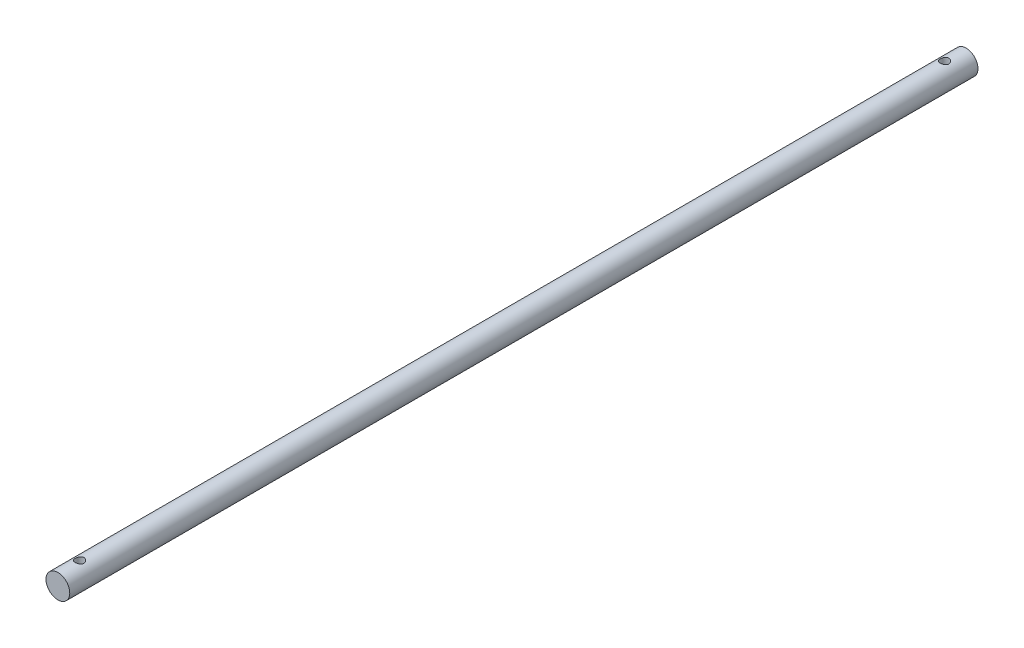
ISO-10303-21;
HEADER;
FILE_DESCRIPTION(('STEP AP214'),'2;1');
FILE_NAME('part.step','',(''),(''),'','','');
FILE_SCHEMA(('AUTOMOTIVE_DESIGN { 1 0 10303 214 1 1 1 1 }'));
ENDSEC;
DATA;
#1=APPLICATION_CONTEXT('core data for automotive mechanical design processes');
#2=APPLICATION_PROTOCOL_DEFINITION('international standard','automotive_design',2000,#1);
#3=PRODUCT_CONTEXT('',#1,'mechanical');
#4=PRODUCT('Part','Part','',(#3));
#5=PRODUCT_RELATED_PRODUCT_CATEGORY('part','',(#4));
#6=PRODUCT_DEFINITION_FORMATION('','',#4);
#7=PRODUCT_DEFINITION_CONTEXT('part definition',#1,'design');
#8=PRODUCT_DEFINITION('design','',#6,#7);
#9=PRODUCT_DEFINITION_SHAPE('','',#8);
#10=(LENGTH_UNIT() NAMED_UNIT(*) SI_UNIT(.MILLI.,.METRE.));
#11=(NAMED_UNIT(*) PLANE_ANGLE_UNIT() SI_UNIT($,.RADIAN.));
#12=(NAMED_UNIT(*) SI_UNIT($,.STERADIAN.) SOLID_ANGLE_UNIT());
#13=UNCERTAINTY_MEASURE_WITH_UNIT(LENGTH_MEASURE(1.E-05),#10,'distance_accuracy_value','');
#14=(GEOMETRIC_REPRESENTATION_CONTEXT(3) GLOBAL_UNCERTAINTY_ASSIGNED_CONTEXT((#13)) GLOBAL_UNIT_ASSIGNED_CONTEXT((#10,
#11,#12)) REPRESENTATION_CONTEXT('',''));
#15=CARTESIAN_POINT('',(0.,0.,0.));
#16=DIRECTION('',(0.,0.,1.));
#17=DIRECTION('',(1.,0.,0.));
#18=AXIS2_PLACEMENT_3D('',#15,#16,#17);
#19=CARTESIAN_POINT('',(0.,0.,210.));
#20=DIRECTION('',(0.,0.,-1.));
#21=DIRECTION('',(-1.,0.,0.));
#22=AXIS2_PLACEMENT_3D('',#19,#20,#21);
#23=CYLINDRICAL_SURFACE('',#22,2.75);
#24=CARTESIAN_POINT('',(0.,-2.75,206.));
#25=CARTESIAN_POINT('',(0.0542715836124512,-2.75000102828592,206.000001406463));
#26=CARTESIAN_POINT('',(0.108533268023081,-2.74837919091224,205.995567902627));
#27=CARTESIAN_POINT('',(0.215441396661633,-2.74207073754075,205.978017772416));
#28=CARTESIAN_POINT('',(0.268087964675669,-2.73738435703378,205.964901813232));
#29=CARTESIAN_POINT('',(0.370208982732229,-2.72545162836973,205.930507644077));
#30=CARTESIAN_POINT('',(0.419689127060862,-2.71821003742993,205.909244595846));
#31=CARTESIAN_POINT('',(0.514378106430642,-2.7018931355003,205.859234525943));
#32=CARTESIAN_POINT('',(0.559585868286284,-2.69281736556791,205.830485630665));
#33=CARTESIAN_POINT('',(0.646268474954172,-2.67336544251623,205.765108008407));
#34=CARTESIAN_POINT('',(0.687548063931853,-2.66295402798401,205.728230976144));
#35=CARTESIAN_POINT('',(0.7634919958075,-2.64218336390661,205.6481711256));
#36=CARTESIAN_POINT('',(0.798154485530767,-2.63182412976351,205.604986546799));
#37=CARTESIAN_POINT('',(0.86108520482516,-2.61192692799095,205.511672475245));
#38=CARTESIAN_POINT('',(0.889083899715419,-2.60243096933403,205.461351363906));
#39=CARTESIAN_POINT('',(0.936134697200384,-2.58588061286966,205.356314261985));
#40=CARTESIAN_POINT('',(0.955190130970069,-2.57882530622898,205.301599916698));
#41=CARTESIAN_POINT('',(0.983053381727303,-2.56833043749789,205.191570671626));
#42=CARTESIAN_POINT('',(0.992232085048729,-2.56476051810849,205.136362532154));
#43=CARTESIAN_POINT('',(1.00124109076665,-2.56125788758605,205.025083122115));
#44=CARTESIAN_POINT('',(1.00107496394965,-2.56132378715702,204.969012189421));
#45=CARTESIAN_POINT('',(0.991683838835926,-2.56497242531705,204.860923898732));
#46=CARTESIAN_POINT('',(0.982964271111852,-2.56835894106268,204.808854797382));
#47=CARTESIAN_POINT('',(0.957546210263849,-2.57794255403146,204.706976769156));
#48=CARTESIAN_POINT('',(0.940846587774043,-2.58414004906813,204.657168163286));
#49=CARTESIAN_POINT('',(0.899650242741097,-2.59877143656644,204.560161818709));
#50=CARTESIAN_POINT('',(0.875017252502519,-2.60724394841139,204.513028029977));
#51=CARTESIAN_POINT('',(0.818748232812849,-2.62545692968766,204.423412624226));
#52=CARTESIAN_POINT('',(0.787109890287122,-2.63519781748133,204.380932550743));
#53=CARTESIAN_POINT('',(0.715383379718306,-2.65559784978113,204.299020145248));
#54=CARTESIAN_POINT('',(0.674888914115547,-2.66627621521455,204.259947543065));
#55=CARTESIAN_POINT('',(0.587796439133001,-2.68681874920339,204.189044494753));
#56=CARTESIAN_POINT('',(0.541197601732023,-2.69668280700645,204.157215032717));
#57=CARTESIAN_POINT('',(0.442345741239065,-2.71466109847137,204.101336418754));
#58=CARTESIAN_POINT('',(0.390023720211987,-2.72274937801428,204.07740038853));
#59=CARTESIAN_POINT('',(0.281728959561486,-2.73607360346721,204.038787428692));
#60=CARTESIAN_POINT('',(0.225757751375328,-2.74131073738571,204.02410664222));
#61=CARTESIAN_POINT('',(0.11478608367634,-2.74813714481768,204.005096993463));
#62=CARTESIAN_POINT('',(0.0598790944675544,-2.74989711432767,204.000283267754));
#63=CARTESIAN_POINT('',(-0.0499795667814124,-2.75009397659377,203.999741232411));
#64=CARTESIAN_POINT('',(-0.104931227273116,-2.74853155450921,204.004011049526));
#65=CARTESIAN_POINT('',(-0.21126813036544,-2.74237196117977,204.021141703208));
#66=CARTESIAN_POINT('',(-0.262710667294032,-2.73788504615824,204.03369061233));
#67=CARTESIAN_POINT('',(-0.362728585048038,-2.72643794415668,204.066618428083));
#68=CARTESIAN_POINT('',(-0.411303592012267,-2.71947743550269,204.086998353113));
#69=CARTESIAN_POINT('',(-0.505765388196063,-2.70352785875039,204.13564777837));
#70=CARTESIAN_POINT('',(-0.551535216679319,-2.69448636437226,204.164126674867));
#71=CARTESIAN_POINT('',(-0.637795338528298,-2.67538261287497,204.227926549934));
#72=CARTESIAN_POINT('',(-0.678283760636934,-2.6653199961946,204.263249942621));
#73=CARTESIAN_POINT('',(-0.755135775069422,-2.64460590178417,204.342003894075));
#74=CARTESIAN_POINT('',(-0.791154493963319,-2.63395220828256,204.385771279064));
#75=CARTESIAN_POINT('',(-0.855397050762122,-2.61379664346752,204.478945491726));
#76=CARTESIAN_POINT('',(-0.883620400746453,-2.60429484427326,204.528352672128));
#77=CARTESIAN_POINT('',(-0.931445925955398,-2.5875770963738,204.631686473617));
#78=CARTESIAN_POINT('',(-0.951029808644739,-2.58036600678337,204.685622399021));
#79=CARTESIAN_POINT('',(-0.980719773373599,-2.56923043824549,204.796358723946));
#80=CARTESIAN_POINT('',(-0.990831247611741,-2.56530408958517,204.853157474364));
#81=CARTESIAN_POINT('',(-1.0008235052886,-2.56142114085343,204.96429565408));
#82=CARTESIAN_POINT('',(-1.00128784493909,-2.56123811777665,205.01857518387));
#83=CARTESIAN_POINT('',(-0.993451162726877,-2.56428783487999,205.126394783377));
#84=CARTESIAN_POINT('',(-0.985150873770358,-2.56752028945478,205.179934914543));
#85=CARTESIAN_POINT('',(-0.960464129671412,-2.57685358798143,205.283297477867));
#86=CARTESIAN_POINT('',(-0.944301768141373,-2.58287473014432,205.333181229599));
#87=CARTESIAN_POINT('',(-0.904542113040592,-2.59706506711977,205.429561390045));
#88=CARTESIAN_POINT('',(-0.880942996186518,-2.60523478862223,205.476056964628));
#89=CARTESIAN_POINT('',(-0.825605739738892,-2.62331120262658,205.5668707271));
#90=CARTESIAN_POINT('',(-0.793519132090319,-2.63328440127836,205.610963198092));
#91=CARTESIAN_POINT('',(-0.72267086243472,-2.65360200752593,205.693325075839));
#92=CARTESIAN_POINT('',(-0.683907144647634,-2.66394652866745,205.731592682352));
#93=CARTESIAN_POINT('',(-0.598501849490875,-2.68445803074377,205.803149733144));
#94=CARTESIAN_POINT('',(-0.551564727014751,-2.69459070625497,205.836097749901));
#95=CARTESIAN_POINT('',(-0.45246792393593,-2.71298901447151,205.893618537786));
#96=CARTESIAN_POINT('',(-0.400308357228813,-2.72125468788124,205.918191491512));
#97=CARTESIAN_POINT('',(-0.291211408351302,-2.73509951863932,205.958454833936));
#98=CARTESIAN_POINT('',(-0.234204430246379,-2.74062712951143,205.973975701989));
#99=CARTESIAN_POINT('',(-0.118127131621762,-2.74807603940632,205.9947453228));
#100=CARTESIAN_POINT('',(-0.0590577047217929,-2.74999888103125,205.999998469503));
#101=CARTESIAN_POINT('',(0.,-2.75,206.));
#102=B_SPLINE_CURVE_WITH_KNOTS('',3,(#24,#25,#26,#27,#28,#29,#30,#31,#32,#33,#34,#35,#36,#37,
#38,#39,#40,#41,#42,#43,#44,#45,#46,#47,#48,#49,#50,#51,#52,#53,#54,#55,#56,#57,#58,#59,#60,#61,
#62,#63,#64,#65,#66,#67,#68,#69,#70,#71,#72,#73,#74,#75,#76,#77,#78,#79,#80,#81,#82,#83,#84,#85,
#86,#87,#88,#89,#90,#91,#92,#93,#94,#95,#96,#97,#98,#99,#100,#101),.UNSPECIFIED.,.T.,.F.,(4,2,2,
2,2,2,2,2,2,2,2,2,2,2,2,2,2,2,2,2,2,2,2,2,2,2,2,2,2,2,2,2,2,2,2,2,2,2,4),(0.,0.162597052068218,
0.325181611045026,0.487465058159494,0.649789161721103,0.818009820819269,0.986277522644852,
1.16049696047028,1.33465145364931,1.50200969548544,1.66930398789926,1.82727379536547,
1.98526596590765,2.14613122186677,2.30704967282303,2.47808909474827,2.64915174120858,
2.82256896302791,2.99591387036394,3.16051402694476,3.32508024219343,3.48377539851091,
3.64249119960605,3.80575629202904,3.96907907474736,4.14129930415002,4.31353031056169,
4.4861242554694,4.6586198909163,4.82064870246276,4.982663966086,5.14031020509753,
5.29799512464463,5.46357833931485,5.62921262594589,5.80306928554153,5.97692215434632,
6.1539341379427,6.3308703548449),.UNSPECIFIED.);
#103=CARTESIAN_POINT('',(0.,-2.75,206.));
#104=VERTEX_POINT('',#103);
#105=EDGE_CURVE('E10',#104,#104,#102,.T.);
#106=ORIENTED_EDGE('',*,*,#105,.T.);
#107=EDGE_LOOP('',(#106));
#108=FACE_BOUND('',#107,.T.);
#109=CARTESIAN_POINT('',(0.,2.75,206.));
#110=CARTESIAN_POINT('',(-0.0542715836124512,2.75000102828592,206.000001406463));
#111=CARTESIAN_POINT('',(-0.108533268023081,2.74837919091224,205.995567902627));
#112=CARTESIAN_POINT('',(-0.215441396661633,2.74207073754075,205.978017772416));
#113=CARTESIAN_POINT('',(-0.268087964675669,2.73738435703378,205.964901813232));
#114=CARTESIAN_POINT('',(-0.370208982732229,2.72545162836973,205.930507644077));
#115=CARTESIAN_POINT('',(-0.419689127060862,2.71821003742993,205.909244595846));
#116=CARTESIAN_POINT('',(-0.514378106430642,2.7018931355003,205.859234525943));
#117=CARTESIAN_POINT('',(-0.559585868286284,2.69281736556791,205.830485630665));
#118=CARTESIAN_POINT('',(-0.646268474954172,2.67336544251623,205.765108008407));
#119=CARTESIAN_POINT('',(-0.687548063931853,2.66295402798401,205.728230976144));
#120=CARTESIAN_POINT('',(-0.7634919958075,2.64218336390661,205.6481711256));
#121=CARTESIAN_POINT('',(-0.798154485530767,2.63182412976351,205.604986546799));
#122=CARTESIAN_POINT('',(-0.86108520482516,2.61192692799095,205.511672475245));
#123=CARTESIAN_POINT('',(-0.889083899715419,2.60243096933403,205.461351363906));
#124=CARTESIAN_POINT('',(-0.936134697200384,2.58588061286966,205.356314261985));
#125=CARTESIAN_POINT('',(-0.955190130970069,2.57882530622898,205.301599916698));
#126=CARTESIAN_POINT('',(-0.983053381727303,2.56833043749789,205.191570671626));
#127=CARTESIAN_POINT('',(-0.992232085048729,2.56476051810849,205.136362532154));
#128=CARTESIAN_POINT('',(-1.00124109076665,2.56125788758605,205.025083122115));
#129=CARTESIAN_POINT('',(-1.00107496394965,2.56132378715702,204.969012189421));
#130=CARTESIAN_POINT('',(-0.991683838835926,2.56497242531705,204.860923898732));
#131=CARTESIAN_POINT('',(-0.982964271111852,2.56835894106268,204.808854797382));
#132=CARTESIAN_POINT('',(-0.957546210263849,2.57794255403146,204.706976769156));
#133=CARTESIAN_POINT('',(-0.940846587774043,2.58414004906813,204.657168163286));
#134=CARTESIAN_POINT('',(-0.899650242741097,2.59877143656644,204.560161818709));
#135=CARTESIAN_POINT('',(-0.875017252502519,2.60724394841139,204.513028029977));
#136=CARTESIAN_POINT('',(-0.818748232812849,2.62545692968766,204.423412624226));
#137=CARTESIAN_POINT('',(-0.787109890287122,2.63519781748133,204.380932550743));
#138=CARTESIAN_POINT('',(-0.715383379718306,2.65559784978113,204.299020145248));
#139=CARTESIAN_POINT('',(-0.674888914115547,2.66627621521455,204.259947543065));
#140=CARTESIAN_POINT('',(-0.587796439133001,2.68681874920339,204.189044494753));
#141=CARTESIAN_POINT('',(-0.541197601732023,2.69668280700645,204.157215032717));
#142=CARTESIAN_POINT('',(-0.442345741239065,2.71466109847137,204.101336418754));
#143=CARTESIAN_POINT('',(-0.390023720211987,2.72274937801428,204.07740038853));
#144=CARTESIAN_POINT('',(-0.281728959561486,2.73607360346721,204.038787428692));
#145=CARTESIAN_POINT('',(-0.225757751375328,2.74131073738571,204.02410664222));
#146=CARTESIAN_POINT('',(-0.11478608367634,2.74813714481768,204.005096993463));
#147=CARTESIAN_POINT('',(-0.0598790944675544,2.74989711432767,204.000283267754));
#148=CARTESIAN_POINT('',(0.0499795667814124,2.75009397659377,203.999741232411));
#149=CARTESIAN_POINT('',(0.104931227273116,2.74853155450921,204.004011049526));
#150=CARTESIAN_POINT('',(0.21126813036544,2.74237196117977,204.021141703208));
#151=CARTESIAN_POINT('',(0.262710667294032,2.73788504615824,204.03369061233));
#152=CARTESIAN_POINT('',(0.362728585048038,2.72643794415668,204.066618428083));
#153=CARTESIAN_POINT('',(0.411303592012267,2.71947743550269,204.086998353113));
#154=CARTESIAN_POINT('',(0.505765388196063,2.70352785875039,204.13564777837));
#155=CARTESIAN_POINT('',(0.551535216679319,2.69448636437226,204.164126674867));
#156=CARTESIAN_POINT('',(0.637795338528298,2.67538261287497,204.227926549934));
#157=CARTESIAN_POINT('',(0.678283760636934,2.6653199961946,204.263249942621));
#158=CARTESIAN_POINT('',(0.755135775069422,2.64460590178417,204.342003894075));
#159=CARTESIAN_POINT('',(0.791154493963319,2.63395220828256,204.385771279064));
#160=CARTESIAN_POINT('',(0.855397050762122,2.61379664346752,204.478945491726));
#161=CARTESIAN_POINT('',(0.883620400746453,2.60429484427326,204.528352672128));
#162=CARTESIAN_POINT('',(0.931445925955398,2.5875770963738,204.631686473617));
#163=CARTESIAN_POINT('',(0.951029808644739,2.58036600678337,204.685622399021));
#164=CARTESIAN_POINT('',(0.980719773373599,2.56923043824549,204.796358723946));
#165=CARTESIAN_POINT('',(0.990831247611741,2.56530408958517,204.853157474364));
#166=CARTESIAN_POINT('',(1.0008235052886,2.56142114085343,204.96429565408));
#167=CARTESIAN_POINT('',(1.00128784493909,2.56123811777665,205.01857518387));
#168=CARTESIAN_POINT('',(0.993451162726877,2.56428783487999,205.126394783377));
#169=CARTESIAN_POINT('',(0.985150873770358,2.56752028945478,205.179934914543));
#170=CARTESIAN_POINT('',(0.960464129671412,2.57685358798143,205.283297477867));
#171=CARTESIAN_POINT('',(0.944301768141373,2.58287473014432,205.333181229599));
#172=CARTESIAN_POINT('',(0.904542113040592,2.59706506711977,205.429561390045));
#173=CARTESIAN_POINT('',(0.880942996186518,2.60523478862223,205.476056964628));
#174=CARTESIAN_POINT('',(0.825605739738892,2.62331120262658,205.5668707271));
#175=CARTESIAN_POINT('',(0.793519132090319,2.63328440127836,205.610963198092));
#176=CARTESIAN_POINT('',(0.72267086243472,2.65360200752593,205.693325075839));
#177=CARTESIAN_POINT('',(0.683907144647634,2.66394652866745,205.731592682352));
#178=CARTESIAN_POINT('',(0.598501849490875,2.68445803074377,205.803149733144));
#179=CARTESIAN_POINT('',(0.551564727014751,2.69459070625497,205.836097749901));
#180=CARTESIAN_POINT('',(0.45246792393593,2.71298901447151,205.893618537786));
#181=CARTESIAN_POINT('',(0.400308357228813,2.72125468788124,205.918191491512));
#182=CARTESIAN_POINT('',(0.291211408351302,2.73509951863932,205.958454833936));
#183=CARTESIAN_POINT('',(0.234204430246379,2.74062712951143,205.973975701989));
#184=CARTESIAN_POINT('',(0.118127131621762,2.74807603940632,205.9947453228));
#185=CARTESIAN_POINT('',(0.0590577047217929,2.74999888103125,205.999998469503));
#186=CARTESIAN_POINT('',(0.,2.75,206.));
#187=B_SPLINE_CURVE_WITH_KNOTS('',3,(#109,#110,#111,#112,#113,#114,#115,#116,#117,#118,#119,
#120,#121,#122,#123,#124,#125,#126,#127,#128,#129,#130,#131,#132,#133,#134,#135,#136,#137,#138,
#139,#140,#141,#142,#143,#144,#145,#146,#147,#148,#149,#150,#151,#152,#153,#154,#155,#156,#157,
#158,#159,#160,#161,#162,#163,#164,#165,#166,#167,#168,#169,#170,#171,#172,#173,#174,#175,#176,
#177,#178,#179,#180,#181,#182,#183,#184,#185,#186),.UNSPECIFIED.,.T.,.F.,(4,2,2,2,2,2,2,2,2,2,2,
2,2,2,2,2,2,2,2,2,2,2,2,2,2,2,2,2,2,2,2,2,2,2,2,2,2,2,4),(0.,0.162597052068218,
0.325181611045026,0.487465058159494,0.649789161721103,0.818009820819269,0.986277522644852,
1.16049696047028,1.33465145364931,1.50200969548544,1.66930398789926,1.82727379536547,
1.98526596590765,2.14613122186677,2.30704967282303,2.47808909474827,2.64915174120858,
2.82256896302791,2.99591387036394,3.16051402694476,3.32508024219343,3.48377539851091,
3.64249119960605,3.80575629202904,3.96907907474736,4.14129930415002,4.31353031056169,
4.4861242554694,4.6586198909163,4.82064870246276,4.982663966086,5.14031020509753,
5.29799512464463,5.46357833931485,5.62921262594589,5.80306928554153,5.97692215434632,
6.1539341379427,6.3308703548449),.UNSPECIFIED.);
#188=CARTESIAN_POINT('',(0.,2.75,206.));
#189=VERTEX_POINT('',#188);
#190=EDGE_CURVE('E48',#189,#189,#187,.T.);
#191=ORIENTED_EDGE('',*,*,#190,.T.);
#192=EDGE_LOOP('',(#191));
#193=FACE_BOUND('',#192,.T.);
#194=CARTESIAN_POINT('',(0.,-2.75,6.));
#195=CARTESIAN_POINT('',(0.0542715836124506,-2.75000102828592,6.00000140646301));
#196=CARTESIAN_POINT('',(0.108533268023079,-2.74837919091224,5.9955679026271));
#197=CARTESIAN_POINT('',(0.21544139666163,-2.74207073754075,5.97801777241614));
#198=CARTESIAN_POINT('',(0.268087964675667,-2.73738435703378,5.96490181323215));
#199=CARTESIAN_POINT('',(0.370208982732223,-2.72545162836973,5.93050764407681));
#200=CARTESIAN_POINT('',(0.419689127060851,-2.71821003742993,5.909244595846));
#201=CARTESIAN_POINT('',(0.514378106430632,-2.7018931355003,5.85923452594297));
#202=CARTESIAN_POINT('',(0.559585868286279,-2.69281736556791,5.83048563066504));
#203=CARTESIAN_POINT('',(0.646268474954169,-2.67336544251623,5.76510800840723));
#204=CARTESIAN_POINT('',(0.687548063931846,-2.66295402798401,5.72823097614354));
#205=CARTESIAN_POINT('',(0.763491995807493,-2.64218336390661,5.64817112560046));
#206=CARTESIAN_POINT('',(0.798154485530761,-2.63182412976351,5.60498654679867));
#207=CARTESIAN_POINT('',(0.861085204825156,-2.61192692799095,5.51167247524499));
#208=CARTESIAN_POINT('',(0.889083899715416,-2.60243096933404,5.46135136390573));
#209=CARTESIAN_POINT('',(0.936134697200381,-2.58588061286966,5.35631426198519));
#210=CARTESIAN_POINT('',(0.955190130970066,-2.57882530622898,5.3015999166976));
#211=CARTESIAN_POINT('',(0.983053381727302,-2.56833043749789,5.19157067162577));
#212=CARTESIAN_POINT('',(0.992232085048728,-2.56476051810849,5.13636253215394));
#213=CARTESIAN_POINT('',(1.00124109076666,-2.56125788758604,5.02508312211504));
#214=CARTESIAN_POINT('',(1.00107496394965,-2.56132378715702,4.96901218942072));
#215=CARTESIAN_POINT('',(0.991683838835923,-2.56497242531705,4.86092389873246));
#216=CARTESIAN_POINT('',(0.982964271111848,-2.56835894106269,4.80885479738237));
#217=CARTESIAN_POINT('',(0.957546210263848,-2.57794255403146,4.70697676915627));
#218=CARTESIAN_POINT('',(0.940846587774045,-2.58414004906813,4.65716816328652));
#219=CARTESIAN_POINT('',(0.899650242741096,-2.59877143656644,4.56016181870912));
#220=CARTESIAN_POINT('',(0.875017252502512,-2.60724394841139,4.51302802997743));
#221=CARTESIAN_POINT('',(0.818748232812838,-2.62545692968767,4.42341262422596));
#222=CARTESIAN_POINT('',(0.787109890287113,-2.63519781748133,4.38093255074252));
#223=CARTESIAN_POINT('',(0.715383379718292,-2.65559784978113,4.29902014524766));
#224=CARTESIAN_POINT('',(0.674888914115524,-2.66627621521456,4.25994754306527));
#225=CARTESIAN_POINT('',(0.587796439132981,-2.6868187492034,4.18904449475273));
#226=CARTESIAN_POINT('',(0.541197601732016,-2.69668280700646,4.15721503271689));
#227=CARTESIAN_POINT('',(0.442345741239072,-2.71466109847137,4.10133641875427));
#228=CARTESIAN_POINT('',(0.390023720211995,-2.72274937801428,4.0774003885305));
#229=CARTESIAN_POINT('',(0.281728959561496,-2.73607360346721,4.03878742869171));
#230=CARTESIAN_POINT('',(0.22575775137534,-2.74131073738571,4.02410664222048));
#231=CARTESIAN_POINT('',(0.114786083676352,-2.74813714481768,4.00509699346297));
#232=CARTESIAN_POINT('',(0.059879094467565,-2.74989711432767,4.00028326775355));
#233=CARTESIAN_POINT('',(-0.0499795667814037,-2.75009397659377,3.99974123241068));
#234=CARTESIAN_POINT('',(-0.104931227273107,-2.74853155450921,4.00401104952609));
#235=CARTESIAN_POINT('',(-0.211268130365438,-2.74237196117977,4.02114170320795));
#236=CARTESIAN_POINT('',(-0.262710667294035,-2.73788504615824,4.03369061232952));
#237=CARTESIAN_POINT('',(-0.362728585048041,-2.72643794415668,4.06661842808272));
#238=CARTESIAN_POINT('',(-0.411303592012264,-2.71947743550269,4.08699835311252));
#239=CARTESIAN_POINT('',(-0.505765388196055,-2.70352785875039,4.13564777837027));
#240=CARTESIAN_POINT('',(-0.551535216679312,-2.69448636437226,4.1641266748672));
#241=CARTESIAN_POINT('',(-0.637795338528293,-2.67538261287497,4.22792654993378));
#242=CARTESIAN_POINT('',(-0.678283760636928,-2.6653199961946,4.26324994262138));
#243=CARTESIAN_POINT('',(-0.755135775069412,-2.64460590178417,4.3420038940751));
#244=CARTESIAN_POINT('',(-0.791154493963306,-2.63395220828257,4.38577127906357));
#245=CARTESIAN_POINT('',(-0.85539705076211,-2.61379664346752,4.47894549172622));
#246=CARTESIAN_POINT('',(-0.883620400746442,-2.60429484427327,4.52835267212787));
#247=CARTESIAN_POINT('',(-0.931445925955382,-2.5875770963738,4.63168647361696));
#248=CARTESIAN_POINT('',(-0.951029808644721,-2.58036600678337,4.68562239902092));
#249=CARTESIAN_POINT('',(-0.980719773373587,-2.56923043824549,4.79635872394569));
#250=CARTESIAN_POINT('',(-0.990831247611734,-2.56530408958517,4.85315747436371));
#251=CARTESIAN_POINT('',(-1.0008235052886,-2.56142114085343,4.96429565407962));
#252=CARTESIAN_POINT('',(-1.0012878449391,-2.56123811777665,5.01857518386983));
#253=CARTESIAN_POINT('',(-0.993451162726875,-2.56428783487999,5.12639478337664));
#254=CARTESIAN_POINT('',(-0.985150873770355,-2.56752028945478,5.17993491454317));
#255=CARTESIAN_POINT('',(-0.960464129671408,-2.57685358798143,5.28329747786739));
#256=CARTESIAN_POINT('',(-0.944301768141367,-2.58287473014433,5.33318122959876));
#257=CARTESIAN_POINT('',(-0.904542113040586,-2.59706506711978,5.42956139004495));
#258=CARTESIAN_POINT('',(-0.880942996186517,-2.60523478862223,5.47605696462838));
#259=CARTESIAN_POINT('',(-0.825605739738899,-2.62331120262658,5.56687072709999));
#260=CARTESIAN_POINT('',(-0.793519132090326,-2.63328440127836,5.61096319809228));
#261=CARTESIAN_POINT('',(-0.722670862434719,-2.65360200752593,5.69332507583935));
#262=CARTESIAN_POINT('',(-0.683907144647625,-2.66394652866745,5.73159268235202));
#263=CARTESIAN_POINT('',(-0.598501849490863,-2.68445803074378,5.80314973314453));
#264=CARTESIAN_POINT('',(-0.551564727014746,-2.69459070625497,5.83609774990151));
#265=CARTESIAN_POINT('',(-0.452467923935936,-2.7129890144715,5.89361853778587));
#266=CARTESIAN_POINT('',(-0.400308357228824,-2.72125468788124,5.91819149151242));
#267=CARTESIAN_POINT('',(-0.291211408351315,-2.73509951863932,5.95845483393645));
#268=CARTESIAN_POINT('',(-0.234204430246387,-2.74062712951142,5.97397570198876));
#269=CARTESIAN_POINT('',(-0.118127131621765,-2.74807603940632,5.99474532279986));
#270=CARTESIAN_POINT('',(-0.0590577047217938,-2.74999888103125,5.99999846950335));
#271=CARTESIAN_POINT('',(0.,-2.75,6.));
#272=B_SPLINE_CURVE_WITH_KNOTS('',3,(#194,#195,#196,#197,#198,#199,#200,#201,#202,#203,#204,
#205,#206,#207,#208,#209,#210,#211,#212,#213,#214,#215,#216,#217,#218,#219,#220,#221,#222,#223,
#224,#225,#226,#227,#228,#229,#230,#231,#232,#233,#234,#235,#236,#237,#238,#239,#240,#241,#242,
#243,#244,#245,#246,#247,#248,#249,#250,#251,#252,#253,#254,#255,#256,#257,#258,#259,#260,#261,
#262,#263,#264,#265,#266,#267,#268,#269,#270,#271),.UNSPECIFIED.,.T.,.F.,(4,2,2,2,2,2,2,2,2,2,2,
2,2,2,2,2,2,2,2,2,2,2,2,2,2,2,2,2,2,2,2,2,2,2,2,2,2,2,4),(0.,0.162597052068216,0.32518161104502,
0.48746505815947,0.649789161721097,0.818009820819264,0.986277522644853,1.16049696047027,
1.33465145364928,1.50200969548544,1.66930398789929,1.82727379536547,1.98526596590766,
2.14613122186678,2.30704967282306,2.47808909474829,2.64915174120858,2.8225689630279,
2.99591387036392,3.16051402694474,3.32508024219342,3.48377539851091,3.64249119960605,
3.80575629202903,3.96907907474735,4.14129930414998,4.31353031056167,4.48612425546933,
4.65861989091625,4.82064870246277,4.98266396608599,5.14031020509755,5.2979951246446,
5.46357833931485,5.6292126259459,5.80306928554153,5.9769221543463,6.15393413794269,
6.3308703548449),.UNSPECIFIED.);
#273=CARTESIAN_POINT('',(0.,-2.75,6.));
#274=VERTEX_POINT('',#273);
#275=EDGE_CURVE('E53',#274,#274,#272,.T.);
#276=ORIENTED_EDGE('',*,*,#275,.T.);
#277=EDGE_LOOP('',(#276));
#278=FACE_BOUND('',#277,.T.);
#279=CARTESIAN_POINT('',(0.,2.75,6.));
#280=CARTESIAN_POINT('',(-0.05427158361245,2.75000102828592,6.00000140646301));
#281=CARTESIAN_POINT('',(-0.108533268023079,2.74837919091224,5.9955679026271));
#282=CARTESIAN_POINT('',(-0.21544139666163,2.74207073754075,5.97801777241614));
#283=CARTESIAN_POINT('',(-0.268087964675666,2.73738435703378,5.96490181323215));
#284=CARTESIAN_POINT('',(-0.370208982732222,2.72545162836973,5.93050764407681));
#285=CARTESIAN_POINT('',(-0.419689127060851,2.71821003742993,5.909244595846));
#286=CARTESIAN_POINT('',(-0.514378106430632,2.7018931355003,5.85923452594297));
#287=CARTESIAN_POINT('',(-0.559585868286279,2.69281736556791,5.83048563066504));
#288=CARTESIAN_POINT('',(-0.646268474954169,2.67336544251623,5.76510800840723));
#289=CARTESIAN_POINT('',(-0.687548063931846,2.66295402798401,5.72823097614354));
#290=CARTESIAN_POINT('',(-0.763491995807492,2.64218336390661,5.64817112560046));
#291=CARTESIAN_POINT('',(-0.79815448553076,2.63182412976351,5.60498654679866));
#292=CARTESIAN_POINT('',(-0.861085204825156,2.61192692799095,5.51167247524499));
#293=CARTESIAN_POINT('',(-0.889083899715414,2.60243096933404,5.46135136390573));
#294=CARTESIAN_POINT('',(-0.93613469720038,2.58588061286966,5.35631426198519));
#295=CARTESIAN_POINT('',(-0.955190130970064,2.57882530622898,5.3015999166976));
#296=CARTESIAN_POINT('',(-0.983053381727301,2.56833043749789,5.19157067162576));
#297=CARTESIAN_POINT('',(-0.992232085048727,2.56476051810849,5.13636253215394));
#298=CARTESIAN_POINT('',(-1.00124109076665,2.56125788758605,5.02508312211504));
#299=CARTESIAN_POINT('',(-1.00107496394965,2.56132378715702,4.96901218942072));
#300=CARTESIAN_POINT('',(-0.991683838835922,2.56497242531705,4.86092389873246));
#301=CARTESIAN_POINT('',(-0.982964271111846,2.56835894106269,4.80885479738237));
#302=CARTESIAN_POINT('',(-0.957546210263846,2.57794255403146,4.70697676915627));
#303=CARTESIAN_POINT('',(-0.940846587774043,2.58414004906813,4.65716816328652));
#304=CARTESIAN_POINT('',(-0.899650242741095,2.59877143656644,4.56016181870912));
#305=CARTESIAN_POINT('',(-0.875017252502511,2.60724394841139,4.51302802997743));
#306=CARTESIAN_POINT('',(-0.818748232812837,2.62545692968767,4.42341262422596));
#307=CARTESIAN_POINT('',(-0.787109890287112,2.63519781748133,4.38093255074252));
#308=CARTESIAN_POINT('',(-0.71538337971829,2.65559784978113,4.29902014524766));
#309=CARTESIAN_POINT('',(-0.674888914115522,2.66627621521456,4.25994754306527));
#310=CARTESIAN_POINT('',(-0.587796439132979,2.6868187492034,4.18904449475273));
#311=CARTESIAN_POINT('',(-0.541197601732014,2.69668280700646,4.15721503271689));
#312=CARTESIAN_POINT('',(-0.44234574123907,2.71466109847137,4.10133641875427));
#313=CARTESIAN_POINT('',(-0.390023720211993,2.72274937801428,4.0774003885305));
#314=CARTESIAN_POINT('',(-0.281728959561494,2.73607360346721,4.03878742869171));
#315=CARTESIAN_POINT('',(-0.225757751375338,2.74131073738571,4.02410664222048));
#316=CARTESIAN_POINT('',(-0.11478608367635,2.74813714481768,4.00509699346297));
#317=CARTESIAN_POINT('',(-0.0598790944675633,2.74989711432767,4.00028326775355));
#318=CARTESIAN_POINT('',(0.0499795667814053,2.75009397659377,3.99974123241068));
#319=CARTESIAN_POINT('',(0.104931227273109,2.74853155450921,4.00401104952609));
#320=CARTESIAN_POINT('',(0.211268130365439,2.74237196117977,4.02114170320795));
#321=CARTESIAN_POINT('',(0.262710667294037,2.73788504615824,4.03369061232952));
#322=CARTESIAN_POINT('',(0.362728585048042,2.72643794415668,4.06661842808272));
#323=CARTESIAN_POINT('',(0.411303592012265,2.71947743550269,4.08699835311252));
#324=CARTESIAN_POINT('',(0.505765388196056,2.70352785875039,4.13564777837027));
#325=CARTESIAN_POINT('',(0.551535216679314,2.69448636437226,4.1641266748672));
#326=CARTESIAN_POINT('',(0.637795338528294,2.67538261287497,4.22792654993378));
#327=CARTESIAN_POINT('',(0.678283760636929,2.6653199961946,4.26324994262138));
#328=CARTESIAN_POINT('',(0.755135775069413,2.64460590178417,4.3420038940751));
#329=CARTESIAN_POINT('',(0.791154493963308,2.63395220828256,4.38577127906357));
#330=CARTESIAN_POINT('',(0.855397050762112,2.61379664346752,4.47894549172622));
#331=CARTESIAN_POINT('',(0.883620400746444,2.60429484427327,4.52835267212787));
#332=CARTESIAN_POINT('',(0.931445925955384,2.5875770963738,4.63168647361696));
#333=CARTESIAN_POINT('',(0.951029808644722,2.58036600678337,4.68562239902092));
#334=CARTESIAN_POINT('',(0.980719773373589,2.56923043824549,4.79635872394569));
#335=CARTESIAN_POINT('',(0.990831247611735,2.56530408958517,4.85315747436371));
#336=CARTESIAN_POINT('',(1.00082350528861,2.56142114085343,4.96429565407962));
#337=CARTESIAN_POINT('',(1.0012878449391,2.56123811777665,5.01857518386983));
#338=CARTESIAN_POINT('',(0.993451162726876,2.56428783487999,5.12639478337664));
#339=CARTESIAN_POINT('',(0.985150873770356,2.56752028945478,5.17993491454317));
#340=CARTESIAN_POINT('',(0.960464129671409,2.57685358798143,5.28329747786739));
#341=CARTESIAN_POINT('',(0.944301768141368,2.58287473014433,5.33318122959876));
#342=CARTESIAN_POINT('',(0.904542113040587,2.59706506711978,5.42956139004495));
#343=CARTESIAN_POINT('',(0.880942996186518,2.60523478862223,5.47605696462838));
#344=CARTESIAN_POINT('',(0.8256057397389,2.62331120262658,5.56687072709999));
#345=CARTESIAN_POINT('',(0.793519132090327,2.63328440127836,5.61096319809228));
#346=CARTESIAN_POINT('',(0.72267086243472,2.65360200752593,5.69332507583935));
#347=CARTESIAN_POINT('',(0.683907144647626,2.66394652866745,5.73159268235202));
#348=CARTESIAN_POINT('',(0.598501849490865,2.68445803074378,5.80314973314453));
#349=CARTESIAN_POINT('',(0.551564727014748,2.69459070625497,5.83609774990151));
#350=CARTESIAN_POINT('',(0.452467923935937,2.7129890144715,5.89361853778587));
#351=CARTESIAN_POINT('',(0.400308357228825,2.72125468788124,5.91819149151242));
#352=CARTESIAN_POINT('',(0.291211408351316,2.73509951863932,5.95845483393645));
#353=CARTESIAN_POINT('',(0.234204430246389,2.74062712951142,5.97397570198876));
#354=CARTESIAN_POINT('',(0.118127131621766,2.74807603940632,5.99474532279986));
#355=CARTESIAN_POINT('',(0.0590577047217949,2.74999888103125,5.99999846950335));
#356=CARTESIAN_POINT('',(0.,2.75,6.));
#357=B_SPLINE_CURVE_WITH_KNOTS('',3,(#279,#280,#281,#282,#283,#284,#285,#286,#287,#288,#289,
#290,#291,#292,#293,#294,#295,#296,#297,#298,#299,#300,#301,#302,#303,#304,#305,#306,#307,#308,
#309,#310,#311,#312,#313,#314,#315,#316,#317,#318,#319,#320,#321,#322,#323,#324,#325,#326,#327,
#328,#329,#330,#331,#332,#333,#334,#335,#336,#337,#338,#339,#340,#341,#342,#343,#344,#345,#346,
#347,#348,#349,#350,#351,#352,#353,#354,#355,#356),.UNSPECIFIED.,.T.,.F.,(4,2,2,2,2,2,2,2,2,2,2,
2,2,2,2,2,2,2,2,2,2,2,2,2,2,2,2,2,2,2,2,2,2,2,2,2,2,2,4),(0.,0.162597052068216,
0.325181611045021,0.48746505815947,0.649789161721098,0.818009820819265,0.986277522644853,
1.16049696047027,1.33465145364928,1.50200969548544,1.66930398789929,1.82727379536547,
1.98526596590766,2.14613122186678,2.30704967282306,2.47808909474829,2.64915174120859,
2.8225689630279,2.99591387036392,3.16051402694474,3.32508024219342,3.48377539851091,
3.64249119960605,3.80575629202903,3.96907907474735,4.14129930414998,4.31353031056167,
4.48612425546933,4.65861989091626,4.82064870246277,4.98266396608599,5.14031020509755,
5.2979951246446,5.46357833931485,5.6292126259459,5.80306928554153,5.9769221543463,
6.15393413794269,6.3308703548449),.UNSPECIFIED.);
#358=CARTESIAN_POINT('',(0.,2.75,6.));
#359=VERTEX_POINT('',#358);
#360=EDGE_CURVE('E58',#359,#359,#357,.T.);
#361=ORIENTED_EDGE('',*,*,#360,.T.);
#362=EDGE_LOOP('',(#361));
#363=FACE_BOUND('',#362,.T.);
#364=CARTESIAN_POINT('',(0.,0.,210.));
#365=DIRECTION('',(0.,0.,1.));
#366=DIRECTION('',(1.,0.,0.));
#367=AXIS2_PLACEMENT_3D('',#364,#365,#366);
#368=CIRCLE('',#367,2.75);
#369=CARTESIAN_POINT('',(2.75,0.,210.));
#370=VERTEX_POINT('',#369);
#371=EDGE_CURVE('E87',#370,#370,#368,.T.);
#372=ORIENTED_EDGE('',*,*,#371,.F.);
#373=EDGE_LOOP('',(#372));
#374=FACE_BOUND('',#373,.T.);
#375=CARTESIAN_POINT('',(0.,0.,0.));
#376=DIRECTION('',(0.,0.,1.));
#377=DIRECTION('',(1.,0.,0.));
#378=AXIS2_PLACEMENT_3D('',#375,#376,#377);
#379=CIRCLE('',#378,2.75);
#380=CARTESIAN_POINT('',(2.75,0.,0.));
#381=VERTEX_POINT('',#380);
#382=EDGE_CURVE('E88',#381,#381,#379,.T.);
#383=ORIENTED_EDGE('',*,*,#382,.T.);
#384=EDGE_LOOP('',(#383));
#385=FACE_BOUND('',#384,.T.);
#386=ADVANCED_FACE('F36',(#108,#193,#278,#363,#374,#385),#23,.T.);
#387=CARTESIAN_POINT('',(0.,0.,210.));
#388=DIRECTION('',(0.,0.,1.));
#389=DIRECTION('',(1.,0.,0.));
#390=AXIS2_PLACEMENT_3D('',#387,#388,#389);
#391=PLANE('',#390);
#392=ORIENTED_EDGE('',*,*,#371,.T.);
#393=EDGE_LOOP('',(#392));
#394=FACE_BOUND('',#393,.T.);
#395=ADVANCED_FACE('F79',(#394),#391,.T.);
#396=CARTESIAN_POINT('',(0.,0.,0.));
#397=DIRECTION('',(0.,0.,1.));
#398=DIRECTION('',(1.,0.,0.));
#399=AXIS2_PLACEMENT_3D('',#396,#397,#398);
#400=PLANE('',#399);
#401=ORIENTED_EDGE('',*,*,#382,.F.);
#402=EDGE_LOOP('',(#401));
#403=FACE_BOUND('',#402,.T.);
#404=ADVANCED_FACE('F77',(#403),#400,.F.);
#405=CARTESIAN_POINT('',(0.,-2.75,5.));
#406=DIRECTION('',(0.,1.,0.));
#407=DIRECTION('',(0.,0.,1.));
#408=AXIS2_PLACEMENT_3D('',#405,#406,#407);
#409=CYLINDRICAL_SURFACE('',#408,1.);
#410=ORIENTED_EDGE('',*,*,#360,.F.);
#411=EDGE_LOOP('',(#410));
#412=FACE_BOUND('',#411,.T.);
#413=ORIENTED_EDGE('',*,*,#275,.F.);
#414=EDGE_LOOP('',(#413));
#415=FACE_BOUND('',#414,.T.);
#416=ADVANCED_FACE('F71',(#412,#415),#409,.F.);
#417=CARTESIAN_POINT('',(0.,-2.75,205.));
#418=DIRECTION('',(0.,1.,0.));
#419=DIRECTION('',(0.,0.,1.));
#420=AXIS2_PLACEMENT_3D('',#417,#418,#419);
#421=CYLINDRICAL_SURFACE('',#420,1.);
#422=ORIENTED_EDGE('',*,*,#190,.F.);
#423=EDGE_LOOP('',(#422));
#424=FACE_BOUND('',#423,.T.);
#425=ORIENTED_EDGE('',*,*,#105,.F.);
#426=EDGE_LOOP('',(#425));
#427=FACE_BOUND('',#426,.T.);
#428=ADVANCED_FACE('F68',(#424,#427),#421,.F.);
#429=CLOSED_SHELL('',(#386,#395,#404,#416,#428));
#430=MANIFOLD_SOLID_BREP('B2',#429);
#431=ADVANCED_BREP_SHAPE_REPRESENTATION('',(#18,#430),#14);
#432=SHAPE_DEFINITION_REPRESENTATION(#9,#431);
ENDSEC;
END-ISO-10303-21;
